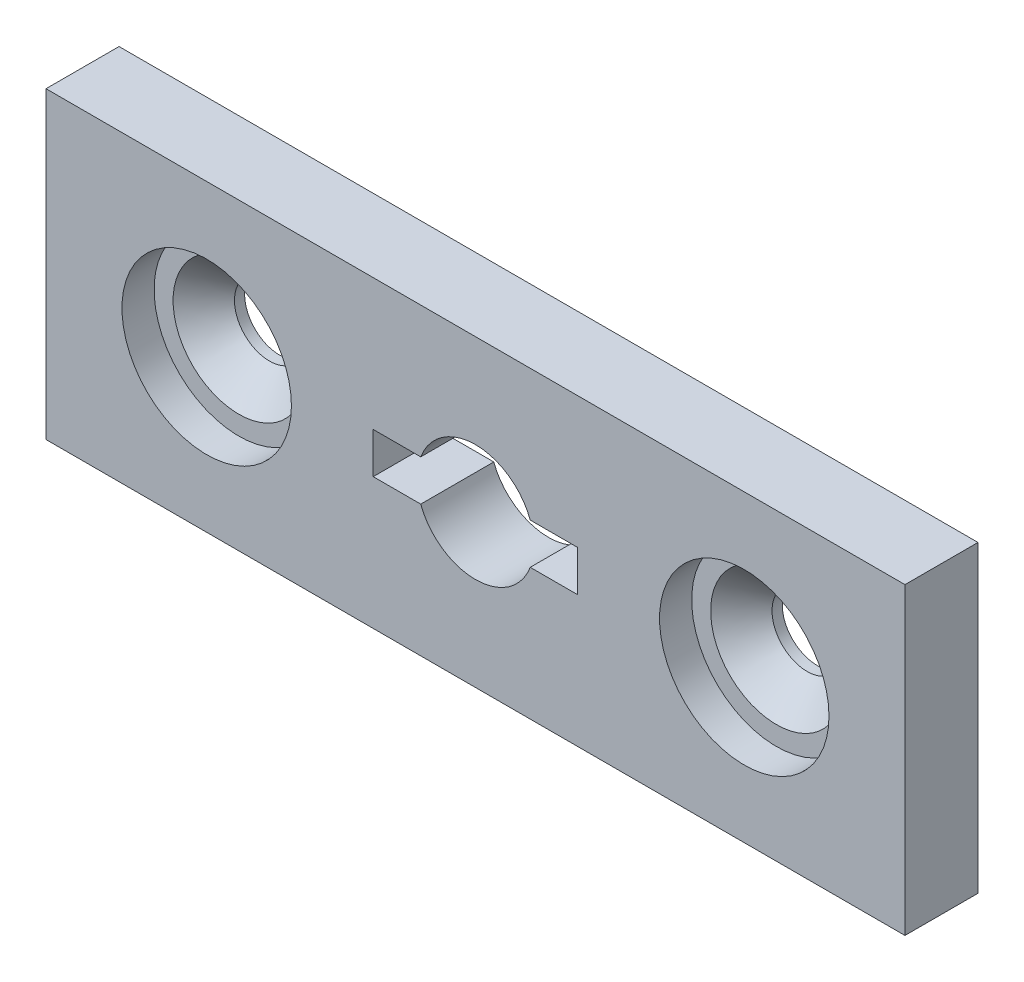
ISO-10303-21;
HEADER;
FILE_DESCRIPTION(('STEP AP214'),'2;1');
FILE_NAME('part.step','',(''),(''),'','','');
FILE_SCHEMA(('AUTOMOTIVE_DESIGN { 1 0 10303 214 1 1 1 1 }'));
ENDSEC;
DATA;
#1=APPLICATION_CONTEXT('core data for automotive mechanical design processes');
#2=APPLICATION_PROTOCOL_DEFINITION('international standard','automotive_design',2000,#1);
#3=PRODUCT_CONTEXT('',#1,'mechanical');
#4=PRODUCT('Part','Part','',(#3));
#5=PRODUCT_RELATED_PRODUCT_CATEGORY('part','',(#4));
#6=PRODUCT_DEFINITION_FORMATION('','',#4);
#7=PRODUCT_DEFINITION_CONTEXT('part definition',#1,'design');
#8=PRODUCT_DEFINITION('design','',#6,#7);
#9=PRODUCT_DEFINITION_SHAPE('','',#8);
#10=(LENGTH_UNIT() NAMED_UNIT(*) SI_UNIT(.MILLI.,.METRE.));
#11=(NAMED_UNIT(*) PLANE_ANGLE_UNIT() SI_UNIT($,.RADIAN.));
#12=(NAMED_UNIT(*) SI_UNIT($,.STERADIAN.) SOLID_ANGLE_UNIT());
#13=UNCERTAINTY_MEASURE_WITH_UNIT(LENGTH_MEASURE(1.E-05),#10,'distance_accuracy_value','');
#14=(GEOMETRIC_REPRESENTATION_CONTEXT(3) GLOBAL_UNCERTAINTY_ASSIGNED_CONTEXT((#13)) GLOBAL_UNIT_ASSIGNED_CONTEXT((#10,
#11,#12)) REPRESENTATION_CONTEXT('',''));
#15=CARTESIAN_POINT('',(0.,0.,0.));
#16=DIRECTION('',(0.,0.,1.));
#17=DIRECTION('',(1.,0.,0.));
#18=AXIS2_PLACEMENT_3D('',#15,#16,#17);
#19=CARTESIAN_POINT('',(0.,0.,-2.5));
#20=DIRECTION('',(0.,0.,1.));
#21=DIRECTION('',(1.,0.,0.));
#22=AXIS2_PLACEMENT_3D('',#19,#20,#21);
#23=CYLINDRICAL_SURFACE('',#22,2.);
#24=CARTESIAN_POINT('',(0.,0.,0.));
#25=DIRECTION('',(0.,0.,1.));
#26=DIRECTION('',(1.,0.,0.));
#27=AXIS2_PLACEMENT_3D('',#24,#25,#26);
#28=CIRCLE('',#27,2.);
#29=CARTESIAN_POINT('',(-1.87349939951952,-0.7,0.));
#30=VERTEX_POINT('',#29);
#31=CARTESIAN_POINT('',(1.87349939951952,-0.7,0.));
#32=VERTEX_POINT('',#31);
#33=EDGE_CURVE('E185',#30,#32,#28,.T.);
#34=ORIENTED_EDGE('',*,*,#33,.T.);
#35=DIRECTION('',(0.,0.,1.));
#36=VECTOR('',#35,1.);
#37=CARTESIAN_POINT('',(1.87349939951952,-0.7,-2.5));
#38=LINE('',#37,#36);
#39=CARTESIAN_POINT('',(1.87349939951952,-0.7,-2.5));
#40=VERTEX_POINT('',#39);
#41=EDGE_CURVE('E11',#32,#40,#38,.F.);
#42=ORIENTED_EDGE('',*,*,#41,.T.);
#43=CARTESIAN_POINT('',(0.,0.,-2.5));
#44=DIRECTION('',(0.,0.,1.));
#45=DIRECTION('',(1.,0.,0.));
#46=AXIS2_PLACEMENT_3D('',#43,#44,#45);
#47=CIRCLE('',#46,2.);
#48=CARTESIAN_POINT('',(-1.87349939951952,-0.7,-2.5));
#49=VERTEX_POINT('',#48);
#50=EDGE_CURVE('E196',#49,#40,#47,.T.);
#51=ORIENTED_EDGE('',*,*,#50,.F.);
#52=DIRECTION('',(0.,0.,1.));
#53=VECTOR('',#52,1.);
#54=CARTESIAN_POINT('',(-1.87349939951952,-0.7,-2.5));
#55=LINE('',#54,#53);
#56=EDGE_CURVE('E47',#49,#30,#55,.T.);
#57=ORIENTED_EDGE('',*,*,#56,.T.);
#58=EDGE_LOOP('',(#34,#42,#51,#57));
#59=FACE_BOUND('',#58,.T.);
#60=ADVANCED_FACE('F38',(#59),#23,.F.);
#61=CARTESIAN_POINT('',(14.7,-5.2,-2.5));
#62=DIRECTION('',(1.,0.,0.));
#63=DIRECTION('',(0.,0.,-1.));
#64=AXIS2_PLACEMENT_3D('',#61,#62,#63);
#65=PLANE('',#64);
#66=DIRECTION('',(0.,1.,0.));
#67=VECTOR('',#66,1.);
#68=CARTESIAN_POINT('',(14.7,-5.2,0.));
#69=LINE('',#68,#67);
#70=CARTESIAN_POINT('',(14.7,-5.2,0.));
#71=VERTEX_POINT('',#70);
#72=CARTESIAN_POINT('',(14.7,5.2,0.));
#73=VERTEX_POINT('',#72);
#74=EDGE_CURVE('E195',#71,#73,#69,.T.);
#75=ORIENTED_EDGE('',*,*,#74,.F.);
#76=DIRECTION('',(0.,0.,1.));
#77=VECTOR('',#76,1.);
#78=CARTESIAN_POINT('',(14.7,-5.2,-2.5));
#79=LINE('',#78,#77);
#80=CARTESIAN_POINT('',(14.7,-5.2,-2.5));
#81=VERTEX_POINT('',#80);
#82=EDGE_CURVE('E233',#81,#71,#79,.T.);
#83=ORIENTED_EDGE('',*,*,#82,.F.);
#84=DIRECTION('',(0.,1.,0.));
#85=VECTOR('',#84,1.);
#86=CARTESIAN_POINT('',(14.7,-5.2,-2.5));
#87=LINE('',#86,#85);
#88=CARTESIAN_POINT('',(14.7,5.2,-2.5));
#89=VERTEX_POINT('',#88);
#90=EDGE_CURVE('E201',#81,#89,#87,.T.);
#91=ORIENTED_EDGE('',*,*,#90,.T.);
#92=DIRECTION('',(0.,0.,1.));
#93=VECTOR('',#92,1.);
#94=CARTESIAN_POINT('',(14.7,5.2,-2.5));
#95=LINE('',#94,#93);
#96=EDGE_CURVE('E218',#89,#73,#95,.T.);
#97=ORIENTED_EDGE('',*,*,#96,.T.);
#98=EDGE_LOOP('',(#75,#83,#91,#97));
#99=FACE_BOUND('',#98,.T.);
#100=ADVANCED_FACE('F40',(#99),#65,.T.);
#101=CARTESIAN_POINT('',(-14.7,-5.2,-2.5));
#102=DIRECTION('',(0.,-1.,0.));
#103=DIRECTION('',(0.,0.,-1.));
#104=AXIS2_PLACEMENT_3D('',#101,#102,#103);
#105=PLANE('',#104);
#106=DIRECTION('',(1.,0.,0.));
#107=VECTOR('',#106,1.);
#108=CARTESIAN_POINT('',(-14.7,-5.2,0.));
#109=LINE('',#108,#107);
#110=CARTESIAN_POINT('',(-14.7,-5.2,0.));
#111=VERTEX_POINT('',#110);
#112=EDGE_CURVE('E206',#111,#71,#109,.T.);
#113=ORIENTED_EDGE('',*,*,#112,.F.);
#114=DIRECTION('',(0.,0.,1.));
#115=VECTOR('',#114,1.);
#116=CARTESIAN_POINT('',(-14.7,-5.2,-2.5));
#117=LINE('',#116,#115);
#118=CARTESIAN_POINT('',(-14.7,-5.2,-2.5));
#119=VERTEX_POINT('',#118);
#120=EDGE_CURVE('E236',#119,#111,#117,.T.);
#121=ORIENTED_EDGE('',*,*,#120,.F.);
#122=DIRECTION('',(1.,0.,0.));
#123=VECTOR('',#122,1.);
#124=CARTESIAN_POINT('',(-14.7,-5.2,-2.5));
#125=LINE('',#124,#123);
#126=EDGE_CURVE('E214',#119,#81,#125,.T.);
#127=ORIENTED_EDGE('',*,*,#126,.T.);
#128=ORIENTED_EDGE('',*,*,#82,.T.);
#129=EDGE_LOOP('',(#113,#121,#127,#128));
#130=FACE_BOUND('',#129,.T.);
#131=ADVANCED_FACE('F293',(#130),#105,.T.);
#132=CARTESIAN_POINT('',(-14.7,-5.2,-2.5));
#133=DIRECTION('',(-1.,0.,0.));
#134=DIRECTION('',(0.,0.,1.));
#135=AXIS2_PLACEMENT_3D('',#132,#133,#134);
#136=PLANE('',#135);
#137=DIRECTION('',(0.,-1.,0.));
#138=VECTOR('',#137,1.);
#139=CARTESIAN_POINT('',(-14.7,-5.2,0.));
#140=LINE('',#139,#138);
#141=CARTESIAN_POINT('',(-14.7,5.2,0.));
#142=VERTEX_POINT('',#141);
#143=EDGE_CURVE('E226',#142,#111,#140,.T.);
#144=ORIENTED_EDGE('',*,*,#143,.F.);
#145=DIRECTION('',(0.,0.,1.));
#146=VECTOR('',#145,1.);
#147=CARTESIAN_POINT('',(-14.7,5.2,-2.5));
#148=LINE('',#147,#146);
#149=CARTESIAN_POINT('',(-14.7,5.2,-2.5));
#150=VERTEX_POINT('',#149);
#151=EDGE_CURVE('E239',#150,#142,#148,.T.);
#152=ORIENTED_EDGE('',*,*,#151,.F.);
#153=DIRECTION('',(0.,-1.,0.));
#154=VECTOR('',#153,1.);
#155=CARTESIAN_POINT('',(-14.7,-5.2,-2.5));
#156=LINE('',#155,#154);
#157=EDGE_CURVE('E210',#150,#119,#156,.T.);
#158=ORIENTED_EDGE('',*,*,#157,.T.);
#159=ORIENTED_EDGE('',*,*,#120,.T.);
#160=EDGE_LOOP('',(#144,#152,#158,#159));
#161=FACE_BOUND('',#160,.T.);
#162=ADVANCED_FACE('F313',(#161),#136,.T.);
#163=CARTESIAN_POINT('',(-14.7,5.2,-2.5));
#164=DIRECTION('',(0.,1.,0.));
#165=DIRECTION('',(0.,0.,1.));
#166=AXIS2_PLACEMENT_3D('',#163,#164,#165);
#167=PLANE('',#166);
#168=DIRECTION('',(-1.,0.,0.));
#169=VECTOR('',#168,1.);
#170=CARTESIAN_POINT('',(-14.7,5.2,0.));
#171=LINE('',#170,#169);
#172=EDGE_CURVE('E222',#73,#142,#171,.T.);
#173=ORIENTED_EDGE('',*,*,#172,.F.);
#174=ORIENTED_EDGE('',*,*,#96,.F.);
#175=DIRECTION('',(-1.,0.,0.));
#176=VECTOR('',#175,1.);
#177=CARTESIAN_POINT('',(-14.7,5.2,-2.5));
#178=LINE('',#177,#176);
#179=EDGE_CURVE('E205',#89,#150,#178,.T.);
#180=ORIENTED_EDGE('',*,*,#179,.T.);
#181=ORIENTED_EDGE('',*,*,#151,.T.);
#182=EDGE_LOOP('',(#173,#174,#180,#181));
#183=FACE_BOUND('',#182,.T.);
#184=ADVANCED_FACE('F306',(#183),#167,.T.);
#185=CARTESIAN_POINT('',(14.7,5.2,-2.5));
#186=DIRECTION('',(0.,0.,-1.));
#187=DIRECTION('',(-1.,0.,0.));
#188=AXIS2_PLACEMENT_3D('',#185,#186,#187);
#189=PLANE('',#188);
#190=CARTESIAN_POINT('',(9.2,0.,-2.5));
#191=DIRECTION('',(0.,0.,1.));
#192=DIRECTION('',(1.,0.,0.));
#193=AXIS2_PLACEMENT_3D('',#190,#191,#192);
#194=CIRCLE('',#193,1.2);
#195=CARTESIAN_POINT('',(10.4,0.,-2.5));
#196=VERTEX_POINT('',#195);
#197=EDGE_CURVE('E527',#196,#196,#194,.T.);
#198=ORIENTED_EDGE('',*,*,#197,.T.);
#199=EDGE_LOOP('',(#198));
#200=FACE_BOUND('',#199,.T.);
#201=CARTESIAN_POINT('',(-9.2,0.,-2.5));
#202=DIRECTION('',(0.,0.,1.));
#203=DIRECTION('',(1.,0.,0.));
#204=AXIS2_PLACEMENT_3D('',#201,#202,#203);
#205=CIRCLE('',#204,1.2);
#206=CARTESIAN_POINT('',(-8.,0.,-2.5));
#207=VERTEX_POINT('',#206);
#208=EDGE_CURVE('E540',#207,#207,#205,.T.);
#209=ORIENTED_EDGE('',*,*,#208,.T.);
#210=EDGE_LOOP('',(#209));
#211=FACE_BOUND('',#210,.T.);
#212=DIRECTION('',(1.,0.,0.));
#213=VECTOR('',#212,1.);
#214=CARTESIAN_POINT('',(-3.5,-0.7,-2.5));
#215=LINE('',#214,#213);
#216=CARTESIAN_POINT('',(-3.5,-0.7,-2.5));
#217=VERTEX_POINT('',#216);
#218=EDGE_CURVE('E139',#217,#49,#215,.T.);
#219=ORIENTED_EDGE('',*,*,#218,.T.);
#220=ORIENTED_EDGE('',*,*,#50,.T.);
#221=CARTESIAN_POINT('',(3.5,-0.7,-2.5));
#222=VERTEX_POINT('',#221);
#223=EDGE_CURVE('E155',#40,#222,#215,.T.);
#224=ORIENTED_EDGE('',*,*,#223,.T.);
#225=DIRECTION('',(0.,1.,0.));
#226=VECTOR('',#225,1.);
#227=CARTESIAN_POINT('',(3.5,-0.7,-2.5));
#228=LINE('',#227,#226);
#229=CARTESIAN_POINT('',(3.5,0.7,-2.5));
#230=VERTEX_POINT('',#229);
#231=EDGE_CURVE('E133',#222,#230,#228,.T.);
#232=ORIENTED_EDGE('',*,*,#231,.T.);
#233=DIRECTION('',(-1.,0.,0.));
#234=VECTOR('',#233,1.);
#235=CARTESIAN_POINT('',(-3.5,0.7,-2.5));
#236=LINE('',#235,#234);
#237=CARTESIAN_POINT('',(1.87349939951952,0.7,-2.5));
#238=VERTEX_POINT('',#237);
#239=EDGE_CURVE('E142',#230,#238,#236,.T.);
#240=ORIENTED_EDGE('',*,*,#239,.T.);
#241=CARTESIAN_POINT('',(-1.87349939951952,0.7,-2.5));
#242=VERTEX_POINT('',#241);
#243=EDGE_CURVE('E192',#238,#242,#47,.T.);
#244=ORIENTED_EDGE('',*,*,#243,.T.);
#245=CARTESIAN_POINT('',(-3.5,0.7,-2.5));
#246=VERTEX_POINT('',#245);
#247=EDGE_CURVE('E62',#242,#246,#236,.T.);
#248=ORIENTED_EDGE('',*,*,#247,.T.);
#249=DIRECTION('',(0.,-1.,0.));
#250=VECTOR('',#249,1.);
#251=CARTESIAN_POINT('',(-3.5,-0.7,-2.5));
#252=LINE('',#251,#250);
#253=EDGE_CURVE('E149',#246,#217,#252,.T.);
#254=ORIENTED_EDGE('',*,*,#253,.T.);
#255=EDGE_LOOP('',(#219,#220,#224,#232,#240,#244,#248,#254));
#256=FACE_BOUND('',#255,.T.);
#257=ORIENTED_EDGE('',*,*,#90,.F.);
#258=ORIENTED_EDGE('',*,*,#126,.F.);
#259=ORIENTED_EDGE('',*,*,#157,.F.);
#260=ORIENTED_EDGE('',*,*,#179,.F.);
#261=EDGE_LOOP('',(#257,#258,#259,#260));
#262=FACE_BOUND('',#261,.T.);
#263=ADVANCED_FACE('F152',(#200,#211,#256,#262),#189,.T.);
#264=CARTESIAN_POINT('',(14.7,5.2,0.));
#265=DIRECTION('',(0.,0.,-1.));
#266=DIRECTION('',(-1.,0.,0.));
#267=AXIS2_PLACEMENT_3D('',#264,#265,#266);
#268=PLANE('',#267);
#269=CARTESIAN_POINT('',(-9.2,0.,0.));
#270=DIRECTION('',(0.,0.,1.));
#271=DIRECTION('',(1.,0.,0.));
#272=AXIS2_PLACEMENT_3D('',#269,#270,#271);
#273=CIRCLE('',#272,2.9);
#274=CARTESIAN_POINT('',(-6.3,0.,0.));
#275=VERTEX_POINT('',#274);
#276=EDGE_CURVE('E544',#275,#275,#273,.T.);
#277=ORIENTED_EDGE('',*,*,#276,.F.);
#278=EDGE_LOOP('',(#277));
#279=FACE_BOUND('',#278,.T.);
#280=CARTESIAN_POINT('',(9.2,0.,0.));
#281=DIRECTION('',(0.,0.,1.));
#282=DIRECTION('',(1.,0.,0.));
#283=AXIS2_PLACEMENT_3D('',#280,#281,#282);
#284=CIRCLE('',#283,2.9);
#285=CARTESIAN_POINT('',(12.1,0.,0.));
#286=VERTEX_POINT('',#285);
#287=EDGE_CURVE('E166',#286,#286,#284,.T.);
#288=ORIENTED_EDGE('',*,*,#287,.F.);
#289=EDGE_LOOP('',(#288));
#290=FACE_BOUND('',#289,.T.);
#291=ORIENTED_EDGE('',*,*,#33,.F.);
#292=DIRECTION('',(1.,0.,0.));
#293=VECTOR('',#292,1.);
#294=CARTESIAN_POINT('',(-3.5,-0.7,0.));
#295=LINE('',#294,#293);
#296=CARTESIAN_POINT('',(-3.5,-0.7,0.));
#297=VERTEX_POINT('',#296);
#298=EDGE_CURVE('E157',#297,#30,#295,.T.);
#299=ORIENTED_EDGE('',*,*,#298,.F.);
#300=DIRECTION('',(0.,-1.,0.));
#301=VECTOR('',#300,1.);
#302=CARTESIAN_POINT('',(-3.5,-0.7,0.));
#303=LINE('',#302,#301);
#304=CARTESIAN_POINT('',(-3.5,0.7,0.));
#305=VERTEX_POINT('',#304);
#306=EDGE_CURVE('E178',#305,#297,#303,.T.);
#307=ORIENTED_EDGE('',*,*,#306,.F.);
#308=DIRECTION('',(-1.,0.,0.));
#309=VECTOR('',#308,1.);
#310=CARTESIAN_POINT('',(-3.5,0.7,0.));
#311=LINE('',#310,#309);
#312=CARTESIAN_POINT('',(-1.87349939951952,0.7,0.));
#313=VERTEX_POINT('',#312);
#314=EDGE_CURVE('E175',#313,#305,#311,.T.);
#315=ORIENTED_EDGE('',*,*,#314,.F.);
#316=CARTESIAN_POINT('',(1.87349939951952,0.7,0.));
#317=VERTEX_POINT('',#316);
#318=EDGE_CURVE('E197',#317,#313,#28,.T.);
#319=ORIENTED_EDGE('',*,*,#318,.F.);
#320=CARTESIAN_POINT('',(3.5,0.7,0.));
#321=VERTEX_POINT('',#320);
#322=EDGE_CURVE('E54',#321,#317,#311,.T.);
#323=ORIENTED_EDGE('',*,*,#322,.F.);
#324=DIRECTION('',(0.,1.,0.));
#325=VECTOR('',#324,1.);
#326=CARTESIAN_POINT('',(3.5,-0.7,0.));
#327=LINE('',#326,#325);
#328=CARTESIAN_POINT('',(3.5,-0.7,0.));
#329=VERTEX_POINT('',#328);
#330=EDGE_CURVE('E136',#329,#321,#327,.T.);
#331=ORIENTED_EDGE('',*,*,#330,.F.);
#332=EDGE_CURVE('E163',#32,#329,#295,.T.);
#333=ORIENTED_EDGE('',*,*,#332,.F.);
#334=EDGE_LOOP('',(#291,#299,#307,#315,#319,#323,#331,#333));
#335=FACE_BOUND('',#334,.T.);
#336=ORIENTED_EDGE('',*,*,#74,.T.);
#337=ORIENTED_EDGE('',*,*,#172,.T.);
#338=ORIENTED_EDGE('',*,*,#143,.T.);
#339=ORIENTED_EDGE('',*,*,#112,.T.);
#340=EDGE_LOOP('',(#336,#337,#338,#339));
#341=FACE_BOUND('',#340,.T.);
#342=ADVANCED_FACE('F261',(#279,#290,#335,#341),#268,.F.);
#343=ORIENTED_EDGE('',*,*,#318,.T.);
#344=DIRECTION('',(0.,0.,1.));
#345=VECTOR('',#344,1.);
#346=CARTESIAN_POINT('',(-1.87349939951952,0.7,-2.5));
#347=LINE('',#346,#345);
#348=EDGE_CURVE('E246',#313,#242,#347,.F.);
#349=ORIENTED_EDGE('',*,*,#348,.T.);
#350=ORIENTED_EDGE('',*,*,#243,.F.);
#351=DIRECTION('',(0.,0.,1.));
#352=VECTOR('',#351,1.);
#353=CARTESIAN_POINT('',(1.87349939951952,0.7,-2.5));
#354=LINE('',#353,#352);
#355=EDGE_CURVE('E144',#238,#317,#354,.T.);
#356=ORIENTED_EDGE('',*,*,#355,.T.);
#357=EDGE_LOOP('',(#343,#349,#350,#356));
#358=FACE_BOUND('',#357,.T.);
#359=ADVANCED_FACE('F271',(#358),#23,.F.);
#360=CARTESIAN_POINT('',(-3.5,0.7,-2.5));
#361=DIRECTION('',(0.,1.,0.));
#362=DIRECTION('',(0.,0.,1.));
#363=AXIS2_PLACEMENT_3D('',#360,#361,#362);
#364=PLANE('',#363);
#365=ORIENTED_EDGE('',*,*,#239,.F.);
#366=DIRECTION('',(0.,0.,1.));
#367=VECTOR('',#366,1.);
#368=CARTESIAN_POINT('',(3.5,0.7,-2.5));
#369=LINE('',#368,#367);
#370=EDGE_CURVE('E128',#230,#321,#369,.T.);
#371=ORIENTED_EDGE('',*,*,#370,.T.);
#372=ORIENTED_EDGE('',*,*,#322,.T.);
#373=ORIENTED_EDGE('',*,*,#355,.F.);
#374=EDGE_LOOP('',(#365,#371,#372,#373));
#375=FACE_BOUND('',#374,.T.);
#376=ADVANCED_FACE('F143',(#375),#364,.F.);
#377=CARTESIAN_POINT('',(-3.5,-0.7,-2.5));
#378=DIRECTION('',(0.,-1.,0.));
#379=DIRECTION('',(0.,0.,-1.));
#380=AXIS2_PLACEMENT_3D('',#377,#378,#379);
#381=PLANE('',#380);
#382=ORIENTED_EDGE('',*,*,#332,.T.);
#383=DIRECTION('',(0.,0.,1.));
#384=VECTOR('',#383,1.);
#385=CARTESIAN_POINT('',(3.5,-0.7,-2.5));
#386=LINE('',#385,#384);
#387=EDGE_CURVE('E182',#222,#329,#386,.T.);
#388=ORIENTED_EDGE('',*,*,#387,.F.);
#389=ORIENTED_EDGE('',*,*,#223,.F.);
#390=ORIENTED_EDGE('',*,*,#41,.F.);
#391=EDGE_LOOP('',(#382,#388,#389,#390));
#392=FACE_BOUND('',#391,.T.);
#393=ADVANCED_FACE('F267',(#392),#381,.F.);
#394=CARTESIAN_POINT('',(3.5,-0.7,-2.5));
#395=DIRECTION('',(1.,0.,0.));
#396=DIRECTION('',(0.,0.,-1.));
#397=AXIS2_PLACEMENT_3D('',#394,#395,#396);
#398=PLANE('',#397);
#399=ORIENTED_EDGE('',*,*,#330,.T.);
#400=ORIENTED_EDGE('',*,*,#370,.F.);
#401=ORIENTED_EDGE('',*,*,#231,.F.);
#402=ORIENTED_EDGE('',*,*,#387,.T.);
#403=EDGE_LOOP('',(#399,#400,#401,#402));
#404=FACE_BOUND('',#403,.T.);
#405=ADVANCED_FACE('F130',(#404),#398,.F.);
#406=ORIENTED_EDGE('',*,*,#218,.F.);
#407=DIRECTION('',(0.,0.,1.));
#408=VECTOR('',#407,1.);
#409=CARTESIAN_POINT('',(-3.5,-0.7,-2.5));
#410=LINE('',#409,#408);
#411=EDGE_CURVE('E186',#217,#297,#410,.T.);
#412=ORIENTED_EDGE('',*,*,#411,.T.);
#413=ORIENTED_EDGE('',*,*,#298,.T.);
#414=ORIENTED_EDGE('',*,*,#56,.F.);
#415=EDGE_LOOP('',(#406,#412,#413,#414));
#416=FACE_BOUND('',#415,.T.);
#417=ADVANCED_FACE('F275',(#416),#381,.F.);
#418=ORIENTED_EDGE('',*,*,#314,.T.);
#419=DIRECTION('',(0.,0.,1.));
#420=VECTOR('',#419,1.);
#421=CARTESIAN_POINT('',(-3.5,0.7,-2.5));
#422=LINE('',#421,#420);
#423=EDGE_CURVE('E138',#246,#305,#422,.T.);
#424=ORIENTED_EDGE('',*,*,#423,.F.);
#425=ORIENTED_EDGE('',*,*,#247,.F.);
#426=ORIENTED_EDGE('',*,*,#348,.F.);
#427=EDGE_LOOP('',(#418,#424,#425,#426));
#428=FACE_BOUND('',#427,.T.);
#429=ADVANCED_FACE('F277',(#428),#364,.F.);
#430=CARTESIAN_POINT('',(-3.5,-0.7,-2.5));
#431=DIRECTION('',(-1.,0.,0.));
#432=DIRECTION('',(0.,0.,1.));
#433=AXIS2_PLACEMENT_3D('',#430,#431,#432);
#434=PLANE('',#433);
#435=ORIENTED_EDGE('',*,*,#306,.T.);
#436=ORIENTED_EDGE('',*,*,#411,.F.);
#437=ORIENTED_EDGE('',*,*,#253,.F.);
#438=ORIENTED_EDGE('',*,*,#423,.T.);
#439=EDGE_LOOP('',(#435,#436,#437,#438));
#440=FACE_BOUND('',#439,.T.);
#441=ADVANCED_FACE('F274',(#440),#434,.F.);
#442=CARTESIAN_POINT('',(9.2,0.,-1.1));
#443=DIRECTION('',(0.,0.,1.));
#444=DIRECTION('',(1.,0.,0.));
#445=AXIS2_PLACEMENT_3D('',#442,#443,#444);
#446=CYLINDRICAL_SURFACE('',#445,2.9);
#447=CARTESIAN_POINT('',(9.2,0.,-1.1));
#448=DIRECTION('',(0.,0.,1.));
#449=DIRECTION('',(1.,0.,0.));
#450=AXIS2_PLACEMENT_3D('',#447,#448,#449);
#451=CIRCLE('',#450,2.9);
#452=CARTESIAN_POINT('',(12.1,0.,-1.1));
#453=VERTEX_POINT('',#452);
#454=EDGE_CURVE('E176',#453,#453,#451,.T.);
#455=ORIENTED_EDGE('',*,*,#454,.F.);
#456=EDGE_LOOP('',(#455));
#457=FACE_BOUND('',#456,.T.);
#458=ORIENTED_EDGE('',*,*,#287,.T.);
#459=EDGE_LOOP('',(#458));
#460=FACE_BOUND('',#459,.T.);
#461=ADVANCED_FACE('F375',(#457,#460),#446,.F.);
#462=CARTESIAN_POINT('',(9.2,0.,-1.1));
#463=DIRECTION('',(0.,0.,1.));
#464=DIRECTION('',(1.,0.,0.));
#465=AXIS2_PLACEMENT_3D('',#462,#463,#464);
#466=PLANE('',#465);
#467=CARTESIAN_POINT('',(9.2,0.,-1.1));
#468=DIRECTION('',(0.,0.,1.));
#469=DIRECTION('',(1.,0.,0.));
#470=AXIS2_PLACEMENT_3D('',#467,#468,#469);
#471=CIRCLE('',#470,2.25);
#472=CARTESIAN_POINT('',(11.45,0.,-1.1));
#473=VERTEX_POINT('',#472);
#474=EDGE_CURVE('E523',#473,#473,#471,.T.);
#475=ORIENTED_EDGE('',*,*,#474,.F.);
#476=EDGE_LOOP('',(#475));
#477=FACE_BOUND('',#476,.T.);
#478=ORIENTED_EDGE('',*,*,#454,.T.);
#479=EDGE_LOOP('',(#478));
#480=FACE_BOUND('',#479,.T.);
#481=ADVANCED_FACE('F381',(#477,#480),#466,.T.);
#482=CARTESIAN_POINT('',(-9.2,0.,-1.1));
#483=DIRECTION('',(0.,0.,1.));
#484=DIRECTION('',(1.,0.,0.));
#485=AXIS2_PLACEMENT_3D('',#482,#483,#484);
#486=CYLINDRICAL_SURFACE('',#485,2.9);
#487=CARTESIAN_POINT('',(-9.2,0.,-1.1));
#488=DIRECTION('',(0.,0.,1.));
#489=DIRECTION('',(1.,0.,0.));
#490=AXIS2_PLACEMENT_3D('',#487,#488,#489);
#491=CIRCLE('',#490,2.9);
#492=CARTESIAN_POINT('',(-6.3,0.,-1.1));
#493=VERTEX_POINT('',#492);
#494=EDGE_CURVE('E545',#493,#493,#491,.T.);
#495=ORIENTED_EDGE('',*,*,#494,.F.);
#496=EDGE_LOOP('',(#495));
#497=FACE_BOUND('',#496,.T.);
#498=ORIENTED_EDGE('',*,*,#276,.T.);
#499=EDGE_LOOP('',(#498));
#500=FACE_BOUND('',#499,.T.);
#501=ADVANCED_FACE('F388',(#497,#500),#486,.F.);
#502=CARTESIAN_POINT('',(-9.2,0.,-1.1));
#503=DIRECTION('',(0.,0.,1.));
#504=DIRECTION('',(1.,0.,0.));
#505=AXIS2_PLACEMENT_3D('',#502,#503,#504);
#506=PLANE('',#505);
#507=CARTESIAN_POINT('',(-9.2,0.,-1.1));
#508=DIRECTION('',(0.,0.,1.));
#509=DIRECTION('',(1.,0.,0.));
#510=AXIS2_PLACEMENT_3D('',#507,#508,#509);
#511=CIRCLE('',#510,2.25);
#512=CARTESIAN_POINT('',(-6.95,0.,-1.1));
#513=VERTEX_POINT('',#512);
#514=EDGE_CURVE('E533',#513,#513,#511,.T.);
#515=ORIENTED_EDGE('',*,*,#514,.F.);
#516=EDGE_LOOP('',(#515));
#517=FACE_BOUND('',#516,.T.);
#518=ORIENTED_EDGE('',*,*,#494,.T.);
#519=EDGE_LOOP('',(#518));
#520=FACE_BOUND('',#519,.T.);
#521=ADVANCED_FACE('F397',(#517,#520),#506,.T.);
#522=CARTESIAN_POINT('',(-9.2,0.,-1.1));
#523=DIRECTION('',(0.,0.,1.));
#524=DIRECTION('',(1.,0.,0.));
#525=AXIS2_PLACEMENT_3D('',#522,#523,#524);
#526=CYLINDRICAL_SURFACE('',#525,1.2);
#527=ORIENTED_EDGE('',*,*,#208,.F.);
#528=EDGE_LOOP('',(#527));
#529=FACE_BOUND('',#528,.T.);
#530=CARTESIAN_POINT('',(-9.2,0.,-2.15));
#531=DIRECTION('',(0.,0.,1.));
#532=DIRECTION('',(1.,0.,0.));
#533=AXIS2_PLACEMENT_3D('',#530,#531,#532);
#534=CIRCLE('',#533,1.2);
#535=CARTESIAN_POINT('',(-8.,0.,-2.15));
#536=VERTEX_POINT('',#535);
#537=EDGE_CURVE('E537',#536,#536,#534,.T.);
#538=ORIENTED_EDGE('',*,*,#537,.T.);
#539=EDGE_LOOP('',(#538));
#540=FACE_BOUND('',#539,.T.);
#541=ADVANCED_FACE('F406',(#529,#540),#526,.F.);
#542=CARTESIAN_POINT('',(-9.2,0.,-1.1));
#543=DIRECTION('',(0.,0.,1.));
#544=DIRECTION('',(1.,0.,0.));
#545=AXIS2_PLACEMENT_3D('',#542,#543,#544);
#546=CONICAL_SURFACE('',#545,2.25,0.785398163397448);
#547=ORIENTED_EDGE('',*,*,#537,.F.);
#548=EDGE_LOOP('',(#547));
#549=FACE_BOUND('',#548,.T.);
#550=ORIENTED_EDGE('',*,*,#514,.T.);
#551=EDGE_LOOP('',(#550));
#552=FACE_BOUND('',#551,.T.);
#553=ADVANCED_FACE('F415',(#549,#552),#546,.F.);
#554=CARTESIAN_POINT('',(9.2,0.,-1.1));
#555=DIRECTION('',(0.,0.,1.));
#556=DIRECTION('',(1.,0.,0.));
#557=AXIS2_PLACEMENT_3D('',#554,#555,#556);
#558=CYLINDRICAL_SURFACE('',#557,1.19999999999999);
#559=ORIENTED_EDGE('',*,*,#197,.F.);
#560=EDGE_LOOP('',(#559));
#561=FACE_BOUND('',#560,.T.);
#562=CARTESIAN_POINT('',(9.2,0.,-2.15000000000001));
#563=DIRECTION('',(0.,0.,1.));
#564=DIRECTION('',(1.,0.,0.));
#565=AXIS2_PLACEMENT_3D('',#562,#563,#564);
#566=CIRCLE('',#565,1.19999999999999);
#567=CARTESIAN_POINT('',(10.4,0.,-2.15000000000001));
#568=VERTEX_POINT('',#567);
#569=EDGE_CURVE('E520',#568,#568,#566,.T.);
#570=ORIENTED_EDGE('',*,*,#569,.T.);
#571=EDGE_LOOP('',(#570));
#572=FACE_BOUND('',#571,.T.);
#573=ADVANCED_FACE('F423',(#561,#572),#558,.F.);
#574=CARTESIAN_POINT('',(9.2,0.,-1.1));
#575=DIRECTION('',(0.,0.,1.));
#576=DIRECTION('',(1.,0.,0.));
#577=AXIS2_PLACEMENT_3D('',#574,#575,#576);
#578=CONICAL_SURFACE('',#577,2.25,0.785398163397449);
#579=ORIENTED_EDGE('',*,*,#569,.F.);
#580=EDGE_LOOP('',(#579));
#581=FACE_BOUND('',#580,.T.);
#582=ORIENTED_EDGE('',*,*,#474,.T.);
#583=EDGE_LOOP('',(#582));
#584=FACE_BOUND('',#583,.T.);
#585=ADVANCED_FACE('F431',(#581,#584),#578,.F.);
#586=CLOSED_SHELL('',(#60,#100,#131,#162,#184,#263,#342,#359,#376,#393,#405,#417,#429,#441,#461,
#481,#501,#521,#541,#553,#573,#585));
#587=MANIFOLD_SOLID_BREP('B2',#586);
#588=ADVANCED_BREP_SHAPE_REPRESENTATION('',(#18,#587),#14);
#589=SHAPE_DEFINITION_REPRESENTATION(#9,#588);
ENDSEC;
END-ISO-10303-21;
